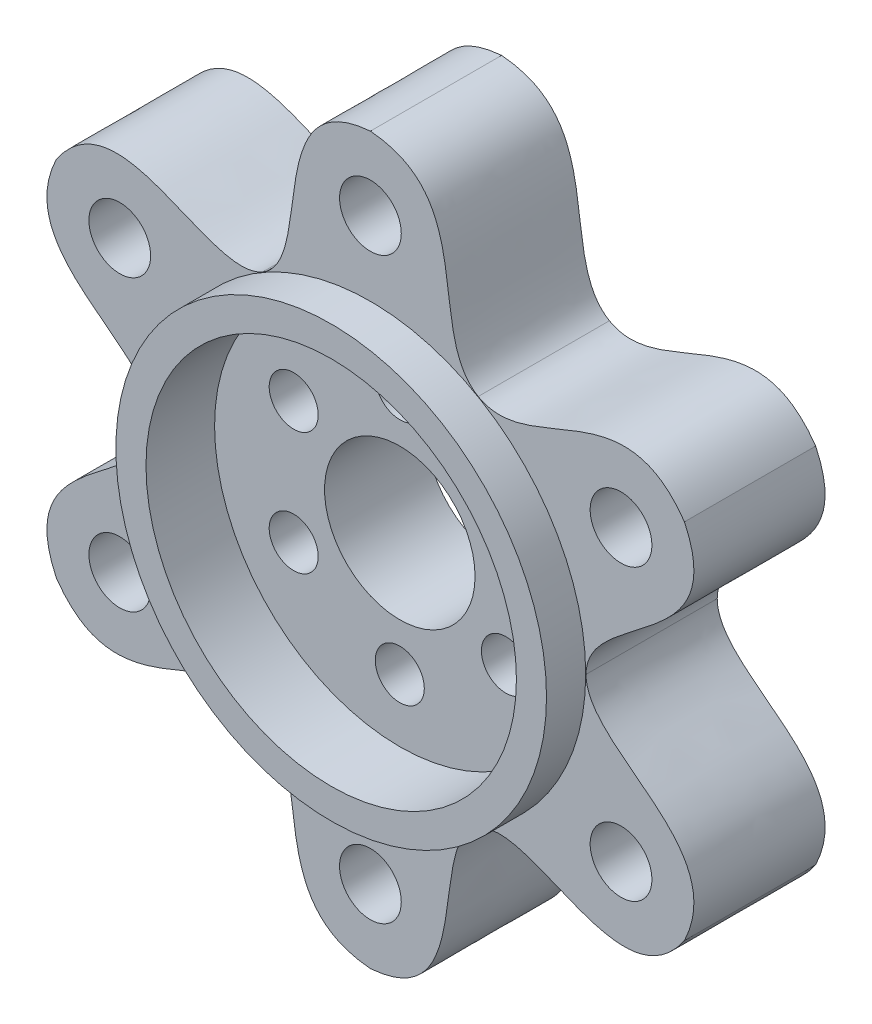
ISO-10303-21;
HEADER;
FILE_DESCRIPTION(('STEP AP214'),'2;1');
FILE_NAME('part.step','',(''),(''),'','','');
FILE_SCHEMA(('AUTOMOTIVE_DESIGN { 1 0 10303 214 1 1 1 1 }'));
ENDSEC;
DATA;
#1=APPLICATION_CONTEXT('core data for automotive mechanical design processes');
#2=APPLICATION_PROTOCOL_DEFINITION('international standard','automotive_design',2000,#1);
#3=PRODUCT_CONTEXT('',#1,'mechanical');
#4=PRODUCT('Part','Part','',(#3));
#5=PRODUCT_RELATED_PRODUCT_CATEGORY('part','',(#4));
#6=PRODUCT_DEFINITION_FORMATION('','',#4);
#7=PRODUCT_DEFINITION_CONTEXT('part definition',#1,'design');
#8=PRODUCT_DEFINITION('design','',#6,#7);
#9=PRODUCT_DEFINITION_SHAPE('','',#8);
#10=(LENGTH_UNIT() NAMED_UNIT(*) SI_UNIT(.MILLI.,.METRE.));
#11=(NAMED_UNIT(*) PLANE_ANGLE_UNIT() SI_UNIT($,.RADIAN.));
#12=(NAMED_UNIT(*) SI_UNIT($,.STERADIAN.) SOLID_ANGLE_UNIT());
#13=UNCERTAINTY_MEASURE_WITH_UNIT(LENGTH_MEASURE(1.E-05),#10,'distance_accuracy_value','');
#14=(GEOMETRIC_REPRESENTATION_CONTEXT(3) GLOBAL_UNCERTAINTY_ASSIGNED_CONTEXT((#13)) GLOBAL_UNIT_ASSIGNED_CONTEXT((#10,
#11,#12)) REPRESENTATION_CONTEXT('',''));
#15=CARTESIAN_POINT('',(0.,0.,0.));
#16=DIRECTION('',(0.,0.,1.));
#17=DIRECTION('',(1.,0.,0.));
#18=AXIS2_PLACEMENT_3D('',#15,#16,#17);
#19=CARTESIAN_POINT('',(13.748153285078,7.9375,17.));
#20=DIRECTION('',(0.,0.,-1.));
#21=DIRECTION('',(-1.,0.,0.));
#22=AXIS2_PLACEMENT_3D('',#19,#20,#21);
#23=CYLINDRICAL_SURFACE('',#22,3.175);
#24=CARTESIAN_POINT('',(13.748153285078,7.9375,0.));
#25=DIRECTION('',(0.,0.,1.));
#26=DIRECTION('',(1.,0.,0.));
#27=AXIS2_PLACEMENT_3D('',#24,#25,#26);
#28=CIRCLE('',#27,3.175);
#29=CARTESIAN_POINT('',(16.923153285078,7.9375,0.));
#30=VERTEX_POINT('',#29);
#31=EDGE_CURVE('E283',#30,#30,#28,.T.);
#32=ORIENTED_EDGE('',*,*,#31,.F.);
#33=EDGE_LOOP('',(#32));
#34=FACE_BOUND('',#33,.T.);
#35=CARTESIAN_POINT('',(13.748153285078,7.9375,13.19));
#36=DIRECTION('',(0.,0.,1.));
#37=DIRECTION('',(1.,0.,0.));
#38=AXIS2_PLACEMENT_3D('',#35,#36,#37);
#39=CIRCLE('',#38,3.175);
#40=CARTESIAN_POINT('',(16.923153285078,7.9375,13.19));
#41=VERTEX_POINT('',#40);
#42=EDGE_CURVE('E533',#41,#41,#39,.T.);
#43=ORIENTED_EDGE('',*,*,#42,.T.);
#44=EDGE_LOOP('',(#43));
#45=FACE_BOUND('',#44,.T.);
#46=ADVANCED_FACE('F273',(#34,#45),#23,.F.);
#47=CARTESIAN_POINT('',(13.748153285078,-7.9375,17.));
#48=DIRECTION('',(0.,0.,-1.));
#49=DIRECTION('',(-1.,0.,0.));
#50=AXIS2_PLACEMENT_3D('',#47,#48,#49);
#51=CYLINDRICAL_SURFACE('',#50,3.175);
#52=CARTESIAN_POINT('',(13.748153285078,-7.9375,0.));
#53=DIRECTION('',(0.,0.,1.));
#54=DIRECTION('',(1.,0.,0.));
#55=AXIS2_PLACEMENT_3D('',#52,#53,#54);
#56=CIRCLE('',#55,3.175);
#57=CARTESIAN_POINT('',(16.923153285078,-7.9375,0.));
#58=VERTEX_POINT('',#57);
#59=EDGE_CURVE('E521',#58,#58,#56,.T.);
#60=ORIENTED_EDGE('',*,*,#59,.F.);
#61=EDGE_LOOP('',(#60));
#62=FACE_BOUND('',#61,.T.);
#63=CARTESIAN_POINT('',(13.748153285078,-7.9375,13.19));
#64=DIRECTION('',(0.,0.,1.));
#65=DIRECTION('',(1.,0.,0.));
#66=AXIS2_PLACEMENT_3D('',#63,#64,#65);
#67=CIRCLE('',#66,3.175);
#68=CARTESIAN_POINT('',(16.923153285078,-7.9375,13.19));
#69=VERTEX_POINT('',#68);
#70=EDGE_CURVE('E536',#69,#69,#67,.T.);
#71=ORIENTED_EDGE('',*,*,#70,.T.);
#72=EDGE_LOOP('',(#71));
#73=FACE_BOUND('',#72,.T.);
#74=ADVANCED_FACE('F529',(#62,#73),#51,.F.);
#75=CARTESIAN_POINT('',(0.,-15.875,17.));
#76=DIRECTION('',(0.,0.,-1.));
#77=DIRECTION('',(-1.,0.,0.));
#78=AXIS2_PLACEMENT_3D('',#75,#76,#77);
#79=CYLINDRICAL_SURFACE('',#78,3.175);
#80=CARTESIAN_POINT('',(0.,-15.875,0.));
#81=DIRECTION('',(0.,0.,1.));
#82=DIRECTION('',(1.,0.,0.));
#83=AXIS2_PLACEMENT_3D('',#80,#81,#82);
#84=CIRCLE('',#83,3.175);
#85=CARTESIAN_POINT('',(3.175,-15.875,0.));
#86=VERTEX_POINT('',#85);
#87=EDGE_CURVE('E518',#86,#86,#84,.T.);
#88=ORIENTED_EDGE('',*,*,#87,.F.);
#89=EDGE_LOOP('',(#88));
#90=FACE_BOUND('',#89,.T.);
#91=CARTESIAN_POINT('',(0.,-15.875,13.19));
#92=DIRECTION('',(0.,0.,1.));
#93=DIRECTION('',(1.,0.,0.));
#94=AXIS2_PLACEMENT_3D('',#91,#92,#93);
#95=CIRCLE('',#94,3.175);
#96=CARTESIAN_POINT('',(3.175,-15.875,13.19));
#97=VERTEX_POINT('',#96);
#98=EDGE_CURVE('E542',#97,#97,#95,.T.);
#99=ORIENTED_EDGE('',*,*,#98,.T.);
#100=EDGE_LOOP('',(#99));
#101=FACE_BOUND('',#100,.T.);
#102=ADVANCED_FACE('F759',(#90,#101),#79,.F.);
#103=CARTESIAN_POINT('',(-13.748153285078,-7.93750000000001,17.));
#104=DIRECTION('',(0.,0.,-1.));
#105=DIRECTION('',(-1.,0.,0.));
#106=AXIS2_PLACEMENT_3D('',#103,#104,#105);
#107=CYLINDRICAL_SURFACE('',#106,3.175);
#108=CARTESIAN_POINT('',(-13.748153285078,-7.93750000000001,0.));
#109=DIRECTION('',(0.,0.,1.));
#110=DIRECTION('',(1.,0.,0.));
#111=AXIS2_PLACEMENT_3D('',#108,#109,#110);
#112=CIRCLE('',#111,3.175);
#113=CARTESIAN_POINT('',(-10.573153285078,-7.93750000000001,0.));
#114=VERTEX_POINT('',#113);
#115=EDGE_CURVE('E515',#114,#114,#112,.T.);
#116=ORIENTED_EDGE('',*,*,#115,.F.);
#117=EDGE_LOOP('',(#116));
#118=FACE_BOUND('',#117,.T.);
#119=CARTESIAN_POINT('',(-13.748153285078,-7.93750000000001,13.19));
#120=DIRECTION('',(0.,0.,1.));
#121=DIRECTION('',(1.,0.,0.));
#122=AXIS2_PLACEMENT_3D('',#119,#120,#121);
#123=CIRCLE('',#122,3.175);
#124=CARTESIAN_POINT('',(-10.573153285078,-7.93750000000001,13.19));
#125=VERTEX_POINT('',#124);
#126=EDGE_CURVE('E1036',#125,#125,#123,.T.);
#127=ORIENTED_EDGE('',*,*,#126,.T.);
#128=EDGE_LOOP('',(#127));
#129=FACE_BOUND('',#128,.T.);
#130=ADVANCED_FACE('F769',(#118,#129),#107,.F.);
#131=CARTESIAN_POINT('',(-13.748153285078,7.93749999999999,17.));
#132=DIRECTION('',(0.,0.,-1.));
#133=DIRECTION('',(-1.,0.,0.));
#134=AXIS2_PLACEMENT_3D('',#131,#132,#133);
#135=CYLINDRICAL_SURFACE('',#134,3.175);
#136=CARTESIAN_POINT('',(-13.748153285078,7.93749999999999,0.));
#137=DIRECTION('',(0.,0.,1.));
#138=DIRECTION('',(1.,0.,0.));
#139=AXIS2_PLACEMENT_3D('',#136,#137,#138);
#140=CIRCLE('',#139,3.175);
#141=CARTESIAN_POINT('',(-10.573153285078,7.93749999999999,0.));
#142=VERTEX_POINT('',#141);
#143=EDGE_CURVE('E512',#142,#142,#140,.T.);
#144=ORIENTED_EDGE('',*,*,#143,.F.);
#145=EDGE_LOOP('',(#144));
#146=FACE_BOUND('',#145,.T.);
#147=CARTESIAN_POINT('',(-13.748153285078,7.93749999999999,13.19));
#148=DIRECTION('',(0.,0.,1.));
#149=DIRECTION('',(1.,0.,0.));
#150=AXIS2_PLACEMENT_3D('',#147,#148,#149);
#151=CIRCLE('',#150,3.175);
#152=CARTESIAN_POINT('',(-10.573153285078,7.93749999999999,13.19));
#153=VERTEX_POINT('',#152);
#154=EDGE_CURVE('E1033',#153,#153,#151,.T.);
#155=ORIENTED_EDGE('',*,*,#154,.T.);
#156=EDGE_LOOP('',(#155));
#157=FACE_BOUND('',#156,.T.);
#158=ADVANCED_FACE('F779',(#146,#157),#135,.F.);
#159=CARTESIAN_POINT('',(0.,0.,17.));
#160=DIRECTION('',(0.,0.,-1.));
#161=DIRECTION('',(-1.,0.,0.));
#162=AXIS2_PLACEMENT_3D('',#159,#160,#161);
#163=CYLINDRICAL_SURFACE('',#162,9.75);
#164=CARTESIAN_POINT('',(0.,0.,0.));
#165=DIRECTION('',(0.,0.,1.));
#166=DIRECTION('',(1.,0.,0.));
#167=AXIS2_PLACEMENT_3D('',#164,#165,#166);
#168=CIRCLE('',#167,9.75);
#169=CARTESIAN_POINT('',(9.75,0.,0.));
#170=VERTEX_POINT('',#169);
#171=EDGE_CURVE('E509',#170,#170,#168,.T.);
#172=ORIENTED_EDGE('',*,*,#171,.F.);
#173=EDGE_LOOP('',(#172));
#174=FACE_BOUND('',#173,.T.);
#175=CARTESIAN_POINT('',(0.,0.,13.19));
#176=DIRECTION('',(0.,0.,1.));
#177=DIRECTION('',(1.,0.,0.));
#178=AXIS2_PLACEMENT_3D('',#175,#176,#177);
#179=CIRCLE('',#178,9.75);
#180=CARTESIAN_POINT('',(9.75,0.,13.19));
#181=VERTEX_POINT('',#180);
#182=EDGE_CURVE('E1029',#181,#181,#179,.T.);
#183=ORIENTED_EDGE('',*,*,#182,.T.);
#184=EDGE_LOOP('',(#183));
#185=FACE_BOUND('',#184,.T.);
#186=ADVANCED_FACE('F789',(#174,#185),#163,.F.);
#187=CARTESIAN_POINT('',(0.,15.875,17.));
#188=DIRECTION('',(0.,0.,-1.));
#189=DIRECTION('',(-1.,0.,0.));
#190=AXIS2_PLACEMENT_3D('',#187,#188,#189);
#191=CYLINDRICAL_SURFACE('',#190,3.175);
#192=CARTESIAN_POINT('',(0.,15.875,0.));
#193=DIRECTION('',(0.,0.,1.));
#194=DIRECTION('',(1.,0.,0.));
#195=AXIS2_PLACEMENT_3D('',#192,#193,#194);
#196=CIRCLE('',#195,3.175);
#197=CARTESIAN_POINT('',(3.175,15.875,0.));
#198=VERTEX_POINT('',#197);
#199=EDGE_CURVE('E504',#198,#198,#196,.T.);
#200=ORIENTED_EDGE('',*,*,#199,.F.);
#201=EDGE_LOOP('',(#200));
#202=FACE_BOUND('',#201,.T.);
#203=CARTESIAN_POINT('',(0.,15.875,13.19));
#204=DIRECTION('',(0.,0.,1.));
#205=DIRECTION('',(1.,0.,0.));
#206=AXIS2_PLACEMENT_3D('',#203,#204,#205);
#207=CIRCLE('',#206,3.175);
#208=CARTESIAN_POINT('',(3.175,15.875,13.19));
#209=VERTEX_POINT('',#208);
#210=EDGE_CURVE('E277',#209,#209,#207,.T.);
#211=ORIENTED_EDGE('',*,*,#210,.T.);
#212=EDGE_LOOP('',(#211));
#213=FACE_BOUND('',#212,.T.);
#214=ADVANCED_FACE('F799',(#202,#213),#191,.F.);
#215=CARTESIAN_POINT('',(0.,0.,17.));
#216=DIRECTION('',(0.,0.,1.));
#217=DIRECTION('',(1.,0.,0.));
#218=AXIS2_PLACEMENT_3D('',#215,#216,#217);
#219=PLANE('',#218);
#220=CARTESIAN_POINT('',(0.,0.,17.));
#221=DIRECTION('',(0.,0.,1.));
#222=DIRECTION('',(1.,0.,0.));
#223=AXIS2_PLACEMENT_3D('',#220,#221,#222);
#224=CIRCLE('',#223,27.9);
#225=CARTESIAN_POINT('',(27.9,0.,17.));
#226=VERTEX_POINT('',#225);
#227=EDGE_CURVE('E12',#226,#226,#224,.T.);
#228=ORIENTED_EDGE('',*,*,#227,.F.);
#229=EDGE_LOOP('',(#228));
#230=FACE_BOUND('',#229,.T.);
#231=CARTESIAN_POINT('',(32.4759523621902,-18.7499999145,17.));
#232=DIRECTION('',(0.,0.,1.));
#233=DIRECTION('',(1.,0.,0.));
#234=AXIS2_PLACEMENT_3D('',#231,#232,#233);
#235=CIRCLE('',#234,3.99999999999999);
#236=CARTESIAN_POINT('',(36.4759523621902,-18.7499999145,17.));
#237=VERTEX_POINT('',#236);
#238=EDGE_CURVE('E477',#237,#237,#235,.T.);
#239=ORIENTED_EDGE('',*,*,#238,.F.);
#240=EDGE_LOOP('',(#239));
#241=FACE_BOUND('',#240,.T.);
#242=CARTESIAN_POINT('',(-32.4759526583709,18.7500000855,17.));
#243=DIRECTION('',(0.,0.,1.));
#244=DIRECTION('',(1.,0.,0.));
#245=AXIS2_PLACEMENT_3D('',#242,#243,#244);
#246=CIRCLE('',#245,4.00000000000001);
#247=CARTESIAN_POINT('',(-28.4759526583709,18.7500000855,17.));
#248=VERTEX_POINT('',#247);
#249=EDGE_CURVE('E489',#248,#248,#246,.T.);
#250=ORIENTED_EDGE('',*,*,#249,.F.);
#251=EDGE_LOOP('',(#250));
#252=FACE_BOUND('',#251,.T.);
#253=CARTESIAN_POINT('',(0.,37.500000057,17.));
#254=DIRECTION('',(0.,0.,1.));
#255=DIRECTION('',(1.,0.,0.));
#256=AXIS2_PLACEMENT_3D('',#253,#254,#255);
#257=CIRCLE('',#256,3.99999999999999);
#258=CARTESIAN_POINT('',(3.99999999999999,37.500000057,17.));
#259=VERTEX_POINT('',#258);
#260=EDGE_CURVE('E501',#259,#259,#257,.T.);
#261=ORIENTED_EDGE('',*,*,#260,.F.);
#262=EDGE_LOOP('',(#261));
#263=FACE_BOUND('',#262,.T.);
#264=CARTESIAN_POINT('',(-32.4759527570978,-18.7499999145,17.));
#265=DIRECTION('',(0.,0.,1.));
#266=DIRECTION('',(1.,0.,0.));
#267=AXIS2_PLACEMENT_3D('',#264,#265,#266);
#268=CIRCLE('',#267,4.00000000000002);
#269=CARTESIAN_POINT('',(-28.4759527570978,-18.7499999145,17.));
#270=VERTEX_POINT('',#269);
#271=EDGE_CURVE('E495',#270,#270,#268,.T.);
#272=ORIENTED_EDGE('',*,*,#271,.F.);
#273=EDGE_LOOP('',(#272));
#274=FACE_BOUND('',#273,.T.);
#275=CARTESIAN_POINT('',(32.4759526583709,18.7500000855,17.));
#276=DIRECTION('',(0.,0.,1.));
#277=DIRECTION('',(1.,0.,0.));
#278=AXIS2_PLACEMENT_3D('',#275,#276,#277);
#279=CIRCLE('',#278,3.99999999999999);
#280=CARTESIAN_POINT('',(36.4759526583709,18.7500000855,17.));
#281=VERTEX_POINT('',#280);
#282=EDGE_CURVE('E483',#281,#281,#279,.T.);
#283=ORIENTED_EDGE('',*,*,#282,.F.);
#284=EDGE_LOOP('',(#283));
#285=FACE_BOUND('',#284,.T.);
#286=CARTESIAN_POINT('',(-1.97453782491142E-07,-37.500000057,17.));
#287=DIRECTION('',(0.,0.,1.));
#288=DIRECTION('',(1.,0.,0.));
#289=AXIS2_PLACEMENT_3D('',#286,#287,#288);
#290=CIRCLE('',#289,4.00000000000001);
#291=CARTESIAN_POINT('',(3.99999980254623,-37.500000057,17.));
#292=VERTEX_POINT('',#291);
#293=EDGE_CURVE('E469',#292,#292,#290,.T.);
#294=ORIENTED_EDGE('',*,*,#293,.F.);
#295=EDGE_LOOP('',(#294));
#296=FACE_BOUND('',#295,.T.);
#297=CARTESIAN_POINT('',(-40.6945337238305,23.4950000000005,17.));
#298=CARTESIAN_POINT('',(-32.6028055293907,35.2247865082349,17.));
#299=CARTESIAN_POINT('',(-20.94881750761,20.2307145845891,17.));
#300=CARTESIAN_POINT('',(-13.97,24.1967497817372,17.));
#301=B_SPLINE_CURVE_WITH_KNOTS('',3,(#297,#298,#299,#300),.UNSPECIFIED.,.F.,.F.,(4,4),(0.,1.),.UNSPECIFIED.);
#302=CARTESIAN_POINT('',(-40.6945337238305,23.4950000000005,17.));
#303=VERTEX_POINT('',#302);
#304=CARTESIAN_POINT('',(-13.97,24.1967497817372,17.));
#305=VERTEX_POINT('',#304);
#306=EDGE_CURVE('E405',#303,#305,#301,.T.);
#307=ORIENTED_EDGE('',*,*,#306,.F.);
#308=CARTESIAN_POINT('',(-40.6945337238305,23.4950000000005,17.));
#309=CARTESIAN_POINT('',(-46.8069627237099,10.6224645689798,17.));
#310=CARTESIAN_POINT('',(-27.9947215207708,8.02685084854053,17.));
#311=CARTESIAN_POINT('',(-27.94,1.94384169859256E-13,17.));
#312=B_SPLINE_CURVE_WITH_KNOTS('',3,(#308,#309,#310,#311),.UNSPECIFIED.,.F.,.F.,(4,4),(0.,1.),.UNSPECIFIED.);
#313=CARTESIAN_POINT('',(-27.94,2.03925399365807E-13,17.));
#314=VERTEX_POINT('',#313);
#315=EDGE_CURVE('E385',#303,#314,#312,.T.);
#316=ORIENTED_EDGE('',*,*,#315,.T.);
#317=CARTESIAN_POINT('',(-40.694533723831,-23.4949999999996,17.));
#318=CARTESIAN_POINT('',(-46.8069627237101,-10.6224645689788,17.));
#319=CARTESIAN_POINT('',(-27.9947215207715,-8.02685084853972,17.));
#320=CARTESIAN_POINT('',(-27.94,2.03925399365807E-13,17.));
#321=B_SPLINE_CURVE_WITH_KNOTS('',3,(#317,#318,#319,#320),.UNSPECIFIED.,.F.,.F.,(4,4),(0.,1.),.UNSPECIFIED.);
#322=CARTESIAN_POINT('',(-40.694533723831,-23.4949999999996,17.));
#323=VERTEX_POINT('',#322);
#324=EDGE_CURVE('E398',#323,#314,#321,.T.);
#325=ORIENTED_EDGE('',*,*,#324,.F.);
#326=CARTESIAN_POINT('',(-40.694533723831,-23.4949999999996,17.));
#327=CARTESIAN_POINT('',(-32.6028055293914,-35.2247865082342,17.));
#328=CARTESIAN_POINT('',(-20.9488175076101,-20.2307145845882,17.));
#329=CARTESIAN_POINT('',(-13.9700000000001,-24.1967497817372,17.));
#330=B_SPLINE_CURVE_WITH_KNOTS('',3,(#326,#327,#328,#329),.UNSPECIFIED.,.F.,.F.,(4,4),(0.,1.),.UNSPECIFIED.);
#331=CARTESIAN_POINT('',(-13.9700000000001,-24.1967497817372,17.));
#332=VERTEX_POINT('',#331);
#333=EDGE_CURVE('E638',#323,#332,#330,.T.);
#334=ORIENTED_EDGE('',*,*,#333,.T.);
#335=CARTESIAN_POINT('',(-3.24659969272524E-13,-46.99,17.));
#336=CARTESIAN_POINT('',(-14.2041571943192,-45.8472510772136,17.));
#337=CARTESIAN_POINT('',(-7.0459040131616,-28.2575654331289,17.));
#338=CARTESIAN_POINT('',(-13.9700000000001,-24.1967497817372,17.));
#339=B_SPLINE_CURVE_WITH_KNOTS('',3,(#335,#336,#337,#338),.UNSPECIFIED.,.F.,.F.,(4,4),(0.,1.),.UNSPECIFIED.);
#340=CARTESIAN_POINT('',(-3.24659969272524E-13,-46.99,17.));
#341=VERTEX_POINT('',#340);
#342=EDGE_CURVE('E646',#341,#332,#339,.T.);
#343=ORIENTED_EDGE('',*,*,#342,.F.);
#344=CARTESIAN_POINT('',(-3.24659969272524E-13,-46.99,17.));
#345=CARTESIAN_POINT('',(14.2041571943185,-45.8472510772138,17.));
#346=CARTESIAN_POINT('',(7.04590401316082,-28.2575654331289,17.));
#347=CARTESIAN_POINT('',(13.9699999999999,-24.1967497817373,17.));
#348=B_SPLINE_CURVE_WITH_KNOTS('',3,(#344,#345,#346,#347),.UNSPECIFIED.,.F.,.F.,(4,4),(0.,1.),.UNSPECIFIED.);
#349=CARTESIAN_POINT('',(13.9699999999999,-24.1967497817373,17.));
#350=VERTEX_POINT('',#349);
#351=EDGE_CURVE('E330',#341,#350,#348,.T.);
#352=ORIENTED_EDGE('',*,*,#351,.T.);
#353=CARTESIAN_POINT('',(40.6945337238307,-23.4950000000002,17.));
#354=CARTESIAN_POINT('',(32.602805529391,-35.2247865082346,17.));
#355=CARTESIAN_POINT('',(20.9488175076099,-20.2307145845891,17.));
#356=CARTESIAN_POINT('',(13.9699999999999,-24.1967497817373,17.));
#357=B_SPLINE_CURVE_WITH_KNOTS('',3,(#353,#354,#355,#356),.UNSPECIFIED.,.F.,.F.,(4,4),(0.,1.),.UNSPECIFIED.);
#358=CARTESIAN_POINT('',(40.6945337238307,-23.4950000000002,17.));
#359=VERTEX_POINT('',#358);
#360=EDGE_CURVE('E590',#359,#350,#357,.T.);
#361=ORIENTED_EDGE('',*,*,#360,.F.);
#362=CARTESIAN_POINT('',(40.6945337238307,-23.4950000000002,17.));
#363=CARTESIAN_POINT('',(46.8069627237099,-10.6224645689795,17.));
#364=CARTESIAN_POINT('',(27.9947215207708,-8.02685084854033,17.));
#365=CARTESIAN_POINT('',(27.94,0.,17.));
#366=B_SPLINE_CURVE_WITH_KNOTS('',3,(#362,#363,#364,#365),.UNSPECIFIED.,.F.,.F.,(4,4),(0.,1.),.UNSPECIFIED.);
#367=CARTESIAN_POINT('',(27.94,0.,17.));
#368=VERTEX_POINT('',#367);
#369=EDGE_CURVE('E446',#359,#368,#366,.T.);
#370=ORIENTED_EDGE('',*,*,#369,.T.);
#371=CARTESIAN_POINT('',(40.6945337238308,23.4949999999999,17.));
#372=CARTESIAN_POINT('',(46.80696272371,10.6224645689791,17.));
#373=CARTESIAN_POINT('',(27.9947215207714,8.02685084853992,17.));
#374=CARTESIAN_POINT('',(27.94,0.,17.));
#375=B_SPLINE_CURVE_WITH_KNOTS('',3,(#371,#372,#373,#374),.UNSPECIFIED.,.F.,.F.,(4,4),(0.,1.),.UNSPECIFIED.);
#376=CARTESIAN_POINT('',(40.6945337238308,23.4949999999999,17.));
#377=VERTEX_POINT('',#376);
#378=EDGE_CURVE('E454',#377,#368,#375,.T.);
#379=ORIENTED_EDGE('',*,*,#378,.F.);
#380=CARTESIAN_POINT('',(40.6945337238308,23.4949999999999,17.));
#381=CARTESIAN_POINT('',(32.6028055293912,35.2247865082344,17.));
#382=CARTESIAN_POINT('',(20.9488175076099,20.2307145845882,17.));
#383=CARTESIAN_POINT('',(13.97,24.1967497817372,17.));
#384=B_SPLINE_CURVE_WITH_KNOTS('',3,(#380,#381,#382,#383),.UNSPECIFIED.,.F.,.F.,(4,4),(0.,1.),.UNSPECIFIED.);
#385=CARTESIAN_POINT('',(13.97,24.1967497817372,17.));
#386=VERTEX_POINT('',#385);
#387=EDGE_CURVE('E308',#377,#386,#384,.T.);
#388=ORIENTED_EDGE('',*,*,#387,.T.);
#389=CARTESIAN_POINT('',(0.,46.99,17.));
#390=CARTESIAN_POINT('',(14.2041571943189,45.8472510772137,17.));
#391=CARTESIAN_POINT('',(7.04590401316146,28.2575654331289,17.));
#392=CARTESIAN_POINT('',(13.97,24.1967497817372,17.));
#393=B_SPLINE_CURVE_WITH_KNOTS('',3,(#389,#390,#391,#392),.UNSPECIFIED.,.F.,.F.,(4,4),(0.,1.),.UNSPECIFIED.);
#394=CARTESIAN_POINT('',(0.,46.99,17.));
#395=VERTEX_POINT('',#394);
#396=EDGE_CURVE('E610',#395,#386,#393,.T.);
#397=ORIENTED_EDGE('',*,*,#396,.F.);
#398=CARTESIAN_POINT('',(0.,46.99,17.));
#399=CARTESIAN_POINT('',(-14.2041571943189,45.8472510772137,17.));
#400=CARTESIAN_POINT('',(-7.04590401316116,28.2575654331289,17.));
#401=CARTESIAN_POINT('',(-13.97,24.1967497817372,17.));
#402=B_SPLINE_CURVE_WITH_KNOTS('',3,(#398,#399,#400,#401),.UNSPECIFIED.,.F.,.F.,(4,4),(0.,1.),.UNSPECIFIED.);
#403=EDGE_CURVE('E401',#395,#305,#402,.T.);
#404=ORIENTED_EDGE('',*,*,#403,.T.);
#405=EDGE_LOOP('',(#307,#316,#325,#334,#343,#352,#361,#370,#379,#388,#397,#404));
#406=FACE_BOUND('',#405,.T.);
#407=ADVANCED_FACE('F661',(#230,#241,#252,#263,#274,#285,#296,#406),#219,.T.);
#408=CARTESIAN_POINT('',(0.,0.,0.));
#409=DIRECTION('',(0.,0.,1.));
#410=DIRECTION('',(1.,0.,0.));
#411=AXIS2_PLACEMENT_3D('',#408,#409,#410);
#412=PLANE('',#411);
#413=CARTESIAN_POINT('',(0.,37.500000057,0.));
#414=DIRECTION('',(0.,0.,1.));
#415=DIRECTION('',(1.,0.,0.));
#416=AXIS2_PLACEMENT_3D('',#413,#414,#415);
#417=CIRCLE('',#416,3.99999999999999);
#418=CARTESIAN_POINT('',(3.99999999999999,37.500000057,0.));
#419=VERTEX_POINT('',#418);
#420=EDGE_CURVE('E498',#419,#419,#417,.T.);
#421=ORIENTED_EDGE('',*,*,#420,.T.);
#422=EDGE_LOOP('',(#421));
#423=FACE_BOUND('',#422,.T.);
#424=CARTESIAN_POINT('',(-32.4759527570978,-18.7499999145,0.));
#425=DIRECTION('',(0.,0.,1.));
#426=DIRECTION('',(1.,0.,0.));
#427=AXIS2_PLACEMENT_3D('',#424,#425,#426);
#428=CIRCLE('',#427,4.00000000000002);
#429=CARTESIAN_POINT('',(-28.4759527570978,-18.7499999145,0.));
#430=VERTEX_POINT('',#429);
#431=EDGE_CURVE('E492',#430,#430,#428,.T.);
#432=ORIENTED_EDGE('',*,*,#431,.T.);
#433=EDGE_LOOP('',(#432));
#434=FACE_BOUND('',#433,.T.);
#435=CARTESIAN_POINT('',(-32.4759526583709,18.7500000855,0.));
#436=DIRECTION('',(0.,0.,1.));
#437=DIRECTION('',(1.,0.,0.));
#438=AXIS2_PLACEMENT_3D('',#435,#436,#437);
#439=CIRCLE('',#438,4.00000000000001);
#440=CARTESIAN_POINT('',(-28.4759526583709,18.7500000855,0.));
#441=VERTEX_POINT('',#440);
#442=EDGE_CURVE('E486',#441,#441,#439,.T.);
#443=ORIENTED_EDGE('',*,*,#442,.T.);
#444=EDGE_LOOP('',(#443));
#445=FACE_BOUND('',#444,.T.);
#446=CARTESIAN_POINT('',(32.4759526583709,18.7500000855,0.));
#447=DIRECTION('',(0.,0.,1.));
#448=DIRECTION('',(1.,0.,0.));
#449=AXIS2_PLACEMENT_3D('',#446,#447,#448);
#450=CIRCLE('',#449,3.99999999999999);
#451=CARTESIAN_POINT('',(36.4759526583709,18.7500000855,0.));
#452=VERTEX_POINT('',#451);
#453=EDGE_CURVE('E480',#452,#452,#450,.T.);
#454=ORIENTED_EDGE('',*,*,#453,.T.);
#455=EDGE_LOOP('',(#454));
#456=FACE_BOUND('',#455,.T.);
#457=CARTESIAN_POINT('',(32.4759523621902,-18.7499999145,0.));
#458=DIRECTION('',(0.,0.,1.));
#459=DIRECTION('',(1.,0.,0.));
#460=AXIS2_PLACEMENT_3D('',#457,#458,#459);
#461=CIRCLE('',#460,3.99999999999999);
#462=CARTESIAN_POINT('',(36.4759523621902,-18.7499999145,0.));
#463=VERTEX_POINT('',#462);
#464=EDGE_CURVE('E472',#463,#463,#461,.T.);
#465=ORIENTED_EDGE('',*,*,#464,.T.);
#466=EDGE_LOOP('',(#465));
#467=FACE_BOUND('',#466,.T.);
#468=CARTESIAN_POINT('',(-1.97453782491142E-07,-37.500000057,0.));
#469=DIRECTION('',(0.,0.,1.));
#470=DIRECTION('',(1.,0.,0.));
#471=AXIS2_PLACEMENT_3D('',#468,#469,#470);
#472=CIRCLE('',#471,4.00000000000001);
#473=CARTESIAN_POINT('',(3.99999980254623,-37.500000057,0.));
#474=VERTEX_POINT('',#473);
#475=EDGE_CURVE('E473',#474,#474,#472,.T.);
#476=ORIENTED_EDGE('',*,*,#475,.T.);
#477=EDGE_LOOP('',(#476));
#478=FACE_BOUND('',#477,.T.);
#479=CARTESIAN_POINT('',(-40.6945337238305,23.4950000000005,0.));
#480=CARTESIAN_POINT('',(-46.8069627237099,10.6224645689798,0.));
#481=CARTESIAN_POINT('',(-27.9947215207708,8.02685084854053,0.));
#482=CARTESIAN_POINT('',(-27.94,1.94384169859256E-13,0.));
#483=B_SPLINE_CURVE_WITH_KNOTS('',3,(#479,#480,#481,#482),.UNSPECIFIED.,.F.,.F.,(4,4),(0.,1.),.UNSPECIFIED.);
#484=CARTESIAN_POINT('',(-40.6945337238305,23.4950000000005,0.));
#485=VERTEX_POINT('',#484);
#486=CARTESIAN_POINT('',(-27.94,2.03925399365807E-13,0.));
#487=VERTEX_POINT('',#486);
#488=EDGE_CURVE('E382',#485,#487,#483,.T.);
#489=ORIENTED_EDGE('',*,*,#488,.F.);
#490=CARTESIAN_POINT('',(-40.6945337238305,23.4950000000005,0.));
#491=CARTESIAN_POINT('',(-32.6028055293907,35.2247865082349,0.));
#492=CARTESIAN_POINT('',(-20.94881750761,20.2307145845891,0.));
#493=CARTESIAN_POINT('',(-13.97,24.1967497817372,0.));
#494=B_SPLINE_CURVE_WITH_KNOTS('',3,(#490,#491,#492,#493),.UNSPECIFIED.,.F.,.F.,(4,4),(0.,1.),.UNSPECIFIED.);
#495=CARTESIAN_POINT('',(-13.97,24.1967497817372,0.));
#496=VERTEX_POINT('',#495);
#497=EDGE_CURVE('E396',#485,#496,#494,.T.);
#498=ORIENTED_EDGE('',*,*,#497,.T.);
#499=CARTESIAN_POINT('',(0.,46.99,0.));
#500=CARTESIAN_POINT('',(-14.2041571943189,45.8472510772137,0.));
#501=CARTESIAN_POINT('',(-7.04590401316116,28.2575654331289,0.));
#502=CARTESIAN_POINT('',(-13.97,24.1967497817372,0.));
#503=B_SPLINE_CURVE_WITH_KNOTS('',3,(#499,#500,#501,#502),.UNSPECIFIED.,.F.,.F.,(4,4),(0.,1.),.UNSPECIFIED.);
#504=CARTESIAN_POINT('',(0.,46.99,0.));
#505=VERTEX_POINT('',#504);
#506=EDGE_CURVE('E292',#505,#496,#503,.T.);
#507=ORIENTED_EDGE('',*,*,#506,.F.);
#508=CARTESIAN_POINT('',(0.,46.99,0.));
#509=CARTESIAN_POINT('',(14.2041571943189,45.8472510772137,0.));
#510=CARTESIAN_POINT('',(7.04590401316146,28.2575654331289,0.));
#511=CARTESIAN_POINT('',(13.97,24.1967497817372,0.));
#512=B_SPLINE_CURVE_WITH_KNOTS('',3,(#508,#509,#510,#511),.UNSPECIFIED.,.F.,.F.,(4,4),(0.,1.),.UNSPECIFIED.);
#513=CARTESIAN_POINT('',(13.97,24.1967497817372,0.));
#514=VERTEX_POINT('',#513);
#515=EDGE_CURVE('E609',#505,#514,#512,.T.);
#516=ORIENTED_EDGE('',*,*,#515,.T.);
#517=CARTESIAN_POINT('',(40.6945337238308,23.4949999999999,0.));
#518=CARTESIAN_POINT('',(32.6028055293912,35.2247865082344,0.));
#519=CARTESIAN_POINT('',(20.9488175076099,20.2307145845882,0.));
#520=CARTESIAN_POINT('',(13.97,24.1967497817372,0.));
#521=B_SPLINE_CURVE_WITH_KNOTS('',3,(#517,#518,#519,#520),.UNSPECIFIED.,.F.,.F.,(4,4),(0.,1.),.UNSPECIFIED.);
#522=CARTESIAN_POINT('',(40.6945337238308,23.4949999999999,0.));
#523=VERTEX_POINT('',#522);
#524=EDGE_CURVE('E336',#523,#514,#521,.T.);
#525=ORIENTED_EDGE('',*,*,#524,.F.);
#526=CARTESIAN_POINT('',(40.6945337238308,23.4949999999999,0.));
#527=CARTESIAN_POINT('',(46.80696272371,10.6224645689791,0.));
#528=CARTESIAN_POINT('',(27.9947215207714,8.02685084853992,0.));
#529=CARTESIAN_POINT('',(27.94,0.,0.));
#530=B_SPLINE_CURVE_WITH_KNOTS('',3,(#526,#527,#528,#529),.UNSPECIFIED.,.F.,.F.,(4,4),(0.,1.),.UNSPECIFIED.);
#531=CARTESIAN_POINT('',(27.94,0.,0.));
#532=VERTEX_POINT('',#531);
#533=EDGE_CURVE('E435',#523,#532,#530,.T.);
#534=ORIENTED_EDGE('',*,*,#533,.T.);
#535=CARTESIAN_POINT('',(40.6945337238307,-23.4950000000002,0.));
#536=CARTESIAN_POINT('',(46.8069627237099,-10.6224645689795,0.));
#537=CARTESIAN_POINT('',(27.9947215207708,-8.02685084854033,0.));
#538=CARTESIAN_POINT('',(27.94,0.,0.));
#539=B_SPLINE_CURVE_WITH_KNOTS('',3,(#535,#536,#537,#538),.UNSPECIFIED.,.F.,.F.,(4,4),(0.,1.),.UNSPECIFIED.);
#540=CARTESIAN_POINT('',(40.6945337238307,-23.4950000000002,0.));
#541=VERTEX_POINT('',#540);
#542=EDGE_CURVE('E442',#541,#532,#539,.T.);
#543=ORIENTED_EDGE('',*,*,#542,.F.);
#544=CARTESIAN_POINT('',(40.6945337238307,-23.4950000000002,0.));
#545=CARTESIAN_POINT('',(32.602805529391,-35.2247865082346,0.));
#546=CARTESIAN_POINT('',(20.9488175076099,-20.2307145845891,0.));
#547=CARTESIAN_POINT('',(13.9699999999999,-24.1967497817373,0.));
#548=B_SPLINE_CURVE_WITH_KNOTS('',3,(#544,#545,#546,#547),.UNSPECIFIED.,.F.,.F.,(4,4),(0.,1.),.UNSPECIFIED.);
#549=CARTESIAN_POINT('',(13.9699999999999,-24.1967497817373,0.));
#550=VERTEX_POINT('',#549);
#551=EDGE_CURVE('E572',#541,#550,#548,.T.);
#552=ORIENTED_EDGE('',*,*,#551,.T.);
#553=CARTESIAN_POINT('',(-3.24659969272524E-13,-46.99,0.));
#554=CARTESIAN_POINT('',(14.2041571943185,-45.8472510772138,0.));
#555=CARTESIAN_POINT('',(7.04590401316082,-28.2575654331289,0.));
#556=CARTESIAN_POINT('',(13.9699999999999,-24.1967497817373,0.));
#557=B_SPLINE_CURVE_WITH_KNOTS('',3,(#553,#554,#555,#556),.UNSPECIFIED.,.F.,.F.,(4,4),(0.,1.),.UNSPECIFIED.);
#558=CARTESIAN_POINT('',(-3.24659969272524E-13,-46.99,0.));
#559=VERTEX_POINT('',#558);
#560=EDGE_CURVE('E579',#559,#550,#557,.T.);
#561=ORIENTED_EDGE('',*,*,#560,.F.);
#562=CARTESIAN_POINT('',(-3.24659969272524E-13,-46.99,0.));
#563=CARTESIAN_POINT('',(-14.2041571943192,-45.8472510772136,0.));
#564=CARTESIAN_POINT('',(-7.0459040131616,-28.2575654331289,0.));
#565=CARTESIAN_POINT('',(-13.9700000000001,-24.1967497817372,0.));
#566=B_SPLINE_CURVE_WITH_KNOTS('',3,(#562,#563,#564,#565),.UNSPECIFIED.,.F.,.F.,(4,4),(0.,1.),.UNSPECIFIED.);
#567=CARTESIAN_POINT('',(-13.9700000000001,-24.1967497817372,0.));
#568=VERTEX_POINT('',#567);
#569=EDGE_CURVE('E628',#559,#568,#566,.T.);
#570=ORIENTED_EDGE('',*,*,#569,.T.);
#571=CARTESIAN_POINT('',(-40.694533723831,-23.4949999999996,0.));
#572=CARTESIAN_POINT('',(-32.6028055293914,-35.2247865082342,0.));
#573=CARTESIAN_POINT('',(-20.9488175076101,-20.2307145845882,0.));
#574=CARTESIAN_POINT('',(-13.9700000000001,-24.1967497817372,0.));
#575=B_SPLINE_CURVE_WITH_KNOTS('',3,(#571,#572,#573,#574),.UNSPECIFIED.,.F.,.F.,(4,4),(0.,1.),.UNSPECIFIED.);
#576=CARTESIAN_POINT('',(-40.694533723831,-23.4949999999996,0.));
#577=VERTEX_POINT('',#576);
#578=EDGE_CURVE('E318',#577,#568,#575,.T.);
#579=ORIENTED_EDGE('',*,*,#578,.F.);
#580=CARTESIAN_POINT('',(-40.694533723831,-23.4949999999996,0.));
#581=CARTESIAN_POINT('',(-46.8069627237101,-10.6224645689788,0.));
#582=CARTESIAN_POINT('',(-27.9947215207715,-8.02685084853972,0.));
#583=CARTESIAN_POINT('',(-27.94,2.03925399365807E-13,0.));
#584=B_SPLINE_CURVE_WITH_KNOTS('',3,(#580,#581,#582,#583),.UNSPECIFIED.,.F.,.F.,(4,4),(0.,1.),.UNSPECIFIED.);
#585=EDGE_CURVE('E397',#577,#487,#584,.T.);
#586=ORIENTED_EDGE('',*,*,#585,.T.);
#587=EDGE_LOOP('',(#489,#498,#507,#516,#525,#534,#543,#552,#561,#570,#579,#586));
#588=FACE_BOUND('',#587,.T.);
#589=ORIENTED_EDGE('',*,*,#199,.T.);
#590=EDGE_LOOP('',(#589));
#591=FACE_BOUND('',#590,.T.);
#592=ORIENTED_EDGE('',*,*,#171,.T.);
#593=EDGE_LOOP('',(#592));
#594=FACE_BOUND('',#593,.T.);
#595=ORIENTED_EDGE('',*,*,#143,.T.);
#596=EDGE_LOOP('',(#595));
#597=FACE_BOUND('',#596,.T.);
#598=ORIENTED_EDGE('',*,*,#115,.T.);
#599=EDGE_LOOP('',(#598));
#600=FACE_BOUND('',#599,.T.);
#601=ORIENTED_EDGE('',*,*,#87,.T.);
#602=EDGE_LOOP('',(#601));
#603=FACE_BOUND('',#602,.T.);
#604=ORIENTED_EDGE('',*,*,#59,.T.);
#605=EDGE_LOOP('',(#604));
#606=FACE_BOUND('',#605,.T.);
#607=ORIENTED_EDGE('',*,*,#31,.T.);
#608=EDGE_LOOP('',(#607));
#609=FACE_BOUND('',#608,.T.);
#610=ADVANCED_FACE('F275',(#423,#434,#445,#456,#467,#478,#588,#591,#594,#597,#600,#603,#606,
#609),#412,.F.);
#611=CARTESIAN_POINT('',(0.,37.500000057,17.));
#612=DIRECTION('',(0.,0.,-1.));
#613=DIRECTION('',(-1.,0.,0.));
#614=AXIS2_PLACEMENT_3D('',#611,#612,#613);
#615=CYLINDRICAL_SURFACE('',#614,3.99999999999999);
#616=ORIENTED_EDGE('',*,*,#260,.T.);
#617=EDGE_LOOP('',(#616));
#618=FACE_BOUND('',#617,.T.);
#619=ORIENTED_EDGE('',*,*,#420,.F.);
#620=EDGE_LOOP('',(#619));
#621=FACE_BOUND('',#620,.T.);
#622=ADVANCED_FACE('F890',(#618,#621),#615,.F.);
#623=CARTESIAN_POINT('',(-32.4759527570978,-18.7499999145,17.));
#624=DIRECTION('',(0.,0.,-1.));
#625=DIRECTION('',(-1.,0.,0.));
#626=AXIS2_PLACEMENT_3D('',#623,#624,#625);
#627=CYLINDRICAL_SURFACE('',#626,4.00000000000002);
#628=ORIENTED_EDGE('',*,*,#271,.T.);
#629=EDGE_LOOP('',(#628));
#630=FACE_BOUND('',#629,.T.);
#631=ORIENTED_EDGE('',*,*,#431,.F.);
#632=EDGE_LOOP('',(#631));
#633=FACE_BOUND('',#632,.T.);
#634=ADVANCED_FACE('F927',(#630,#633),#627,.F.);
#635=CARTESIAN_POINT('',(-32.4759526583709,18.7500000855,17.));
#636=DIRECTION('',(0.,0.,-1.));
#637=DIRECTION('',(-1.,0.,0.));
#638=AXIS2_PLACEMENT_3D('',#635,#636,#637);
#639=CYLINDRICAL_SURFACE('',#638,4.00000000000001);
#640=ORIENTED_EDGE('',*,*,#249,.T.);
#641=EDGE_LOOP('',(#640));
#642=FACE_BOUND('',#641,.T.);
#643=ORIENTED_EDGE('',*,*,#442,.F.);
#644=EDGE_LOOP('',(#643));
#645=FACE_BOUND('',#644,.T.);
#646=ADVANCED_FACE('F917',(#642,#645),#639,.F.);
#647=CARTESIAN_POINT('',(32.4759526583709,18.7500000855,17.));
#648=DIRECTION('',(0.,0.,-1.));
#649=DIRECTION('',(-1.,0.,0.));
#650=AXIS2_PLACEMENT_3D('',#647,#648,#649);
#651=CYLINDRICAL_SURFACE('',#650,3.99999999999999);
#652=ORIENTED_EDGE('',*,*,#282,.T.);
#653=EDGE_LOOP('',(#652));
#654=FACE_BOUND('',#653,.T.);
#655=ORIENTED_EDGE('',*,*,#453,.F.);
#656=EDGE_LOOP('',(#655));
#657=FACE_BOUND('',#656,.T.);
#658=ADVANCED_FACE('F907',(#654,#657),#651,.F.);
#659=CARTESIAN_POINT('',(32.4759523621902,-18.7499999145,17.));
#660=DIRECTION('',(0.,0.,-1.));
#661=DIRECTION('',(-1.,0.,0.));
#662=AXIS2_PLACEMENT_3D('',#659,#660,#661);
#663=CYLINDRICAL_SURFACE('',#662,3.99999999999999);
#664=ORIENTED_EDGE('',*,*,#238,.T.);
#665=EDGE_LOOP('',(#664));
#666=FACE_BOUND('',#665,.T.);
#667=ORIENTED_EDGE('',*,*,#464,.F.);
#668=EDGE_LOOP('',(#667));
#669=FACE_BOUND('',#668,.T.);
#670=ADVANCED_FACE('F898',(#666,#669),#663,.F.);
#671=CARTESIAN_POINT('',(-1.97453782491142E-07,-37.500000057,17.));
#672=DIRECTION('',(0.,0.,-1.));
#673=DIRECTION('',(-1.,0.,0.));
#674=AXIS2_PLACEMENT_3D('',#671,#672,#673);
#675=CYLINDRICAL_SURFACE('',#674,4.00000000000001);
#676=ORIENTED_EDGE('',*,*,#293,.T.);
#677=EDGE_LOOP('',(#676));
#678=FACE_BOUND('',#677,.T.);
#679=ORIENTED_EDGE('',*,*,#475,.F.);
#680=EDGE_LOOP('',(#679));
#681=FACE_BOUND('',#680,.T.);
#682=ADVANCED_FACE('F875',(#678,#681),#675,.F.);
#683=DIRECTION('',(0.,0.,1.));
#684=VECTOR('',#683,1.);
#685=SURFACE_OF_LINEAR_EXTRUSION('',#503,#684);
#686=ORIENTED_EDGE('',*,*,#403,.F.);
#687=DIRECTION('',(0.,0.,1.));
#688=VECTOR('',#687,1.);
#689=CARTESIAN_POINT('',(0.,46.99,0.));
#690=LINE('',#689,#688);
#691=EDGE_CURVE('E476',#505,#395,#690,.T.);
#692=ORIENTED_EDGE('',*,*,#691,.F.);
#693=ORIENTED_EDGE('',*,*,#506,.T.);
#694=DIRECTION('',(0.,0.,1.));
#695=VECTOR('',#694,1.);
#696=CARTESIAN_POINT('',(-13.97,24.1967497817372,0.));
#697=LINE('',#696,#695);
#698=EDGE_CURVE('E390',#496,#305,#697,.T.);
#699=ORIENTED_EDGE('',*,*,#698,.T.);
#700=EDGE_LOOP('',(#686,#692,#693,#699));
#701=FACE_BOUND('',#700,.T.);
#702=ADVANCED_FACE('F425',(#701),#685,.T.);
#703=DIRECTION('',(0.,0.,1.));
#704=VECTOR('',#703,1.);
#705=SURFACE_OF_LINEAR_EXTRUSION('',#494,#704);
#706=ORIENTED_EDGE('',*,*,#306,.T.);
#707=ORIENTED_EDGE('',*,*,#698,.F.);
#708=ORIENTED_EDGE('',*,*,#497,.F.);
#709=DIRECTION('',(0.,0.,1.));
#710=VECTOR('',#709,1.);
#711=CARTESIAN_POINT('',(-40.6945337238305,23.4950000000005,0.));
#712=LINE('',#711,#710);
#713=EDGE_CURVE('E379',#485,#303,#712,.T.);
#714=ORIENTED_EDGE('',*,*,#713,.T.);
#715=EDGE_LOOP('',(#706,#707,#708,#714));
#716=FACE_BOUND('',#715,.T.);
#717=ADVANCED_FACE('F400',(#716),#705,.F.);
#718=DIRECTION('',(0.,0.,1.));
#719=VECTOR('',#718,1.);
#720=SURFACE_OF_LINEAR_EXTRUSION('',#539,#719);
#721=ORIENTED_EDGE('',*,*,#369,.F.);
#722=DIRECTION('',(0.,0.,1.));
#723=VECTOR('',#722,1.);
#724=CARTESIAN_POINT('',(40.6945337238307,-23.4950000000002,0.));
#725=LINE('',#724,#723);
#726=EDGE_CURVE('E441',#541,#359,#725,.T.);
#727=ORIENTED_EDGE('',*,*,#726,.F.);
#728=ORIENTED_EDGE('',*,*,#542,.T.);
#729=DIRECTION('',(0.,0.,1.));
#730=VECTOR('',#729,1.);
#731=CARTESIAN_POINT('',(27.94,0.,0.));
#732=LINE('',#731,#730);
#733=EDGE_CURVE('E463',#532,#368,#732,.T.);
#734=ORIENTED_EDGE('',*,*,#733,.T.);
#735=EDGE_LOOP('',(#721,#727,#728,#734));
#736=FACE_BOUND('',#735,.T.);
#737=ADVANCED_FACE('F424',(#736),#720,.T.);
#738=DIRECTION('',(0.,0.,1.));
#739=VECTOR('',#738,1.);
#740=SURFACE_OF_LINEAR_EXTRUSION('',#530,#739);
#741=ORIENTED_EDGE('',*,*,#378,.T.);
#742=ORIENTED_EDGE('',*,*,#733,.F.);
#743=ORIENTED_EDGE('',*,*,#533,.F.);
#744=DIRECTION('',(0.,0.,1.));
#745=VECTOR('',#744,1.);
#746=CARTESIAN_POINT('',(40.6945337238308,23.4949999999999,0.));
#747=LINE('',#746,#745);
#748=EDGE_CURVE('E349',#523,#377,#747,.T.);
#749=ORIENTED_EDGE('',*,*,#748,.T.);
#750=EDGE_LOOP('',(#741,#742,#743,#749));
#751=FACE_BOUND('',#750,.T.);
#752=ADVANCED_FACE('F427',(#751),#740,.F.);
#753=DIRECTION('',(0.,0.,1.));
#754=VECTOR('',#753,1.);
#755=SURFACE_OF_LINEAR_EXTRUSION('',#575,#754);
#756=ORIENTED_EDGE('',*,*,#333,.F.);
#757=DIRECTION('',(0.,0.,1.));
#758=VECTOR('',#757,1.);
#759=CARTESIAN_POINT('',(-40.694533723831,-23.4949999999996,0.));
#760=LINE('',#759,#758);
#761=EDGE_CURVE('E411',#577,#323,#760,.T.);
#762=ORIENTED_EDGE('',*,*,#761,.F.);
#763=ORIENTED_EDGE('',*,*,#578,.T.);
#764=DIRECTION('',(0.,0.,1.));
#765=VECTOR('',#764,1.);
#766=CARTESIAN_POINT('',(-13.9700000000001,-24.1967497817372,0.));
#767=LINE('',#766,#765);
#768=EDGE_CURVE('E455',#568,#332,#767,.T.);
#769=ORIENTED_EDGE('',*,*,#768,.T.);
#770=EDGE_LOOP('',(#756,#762,#763,#769));
#771=FACE_BOUND('',#770,.T.);
#772=ADVANCED_FACE('F431',(#771),#755,.T.);
#773=DIRECTION('',(0.,0.,1.));
#774=VECTOR('',#773,1.);
#775=SURFACE_OF_LINEAR_EXTRUSION('',#566,#774);
#776=ORIENTED_EDGE('',*,*,#342,.T.);
#777=ORIENTED_EDGE('',*,*,#768,.F.);
#778=ORIENTED_EDGE('',*,*,#569,.F.);
#779=DIRECTION('',(0.,0.,1.));
#780=VECTOR('',#779,1.);
#781=CARTESIAN_POINT('',(-3.24659969272524E-13,-46.99,0.));
#782=LINE('',#781,#780);
#783=EDGE_CURVE('E578',#559,#341,#782,.T.);
#784=ORIENTED_EDGE('',*,*,#783,.T.);
#785=EDGE_LOOP('',(#776,#777,#778,#784));
#786=FACE_BOUND('',#785,.T.);
#787=ADVANCED_FACE('F623',(#786),#775,.F.);
#788=DIRECTION('',(0.,0.,1.));
#789=VECTOR('',#788,1.);
#790=SURFACE_OF_LINEAR_EXTRUSION('',#521,#789);
#791=ORIENTED_EDGE('',*,*,#387,.F.);
#792=ORIENTED_EDGE('',*,*,#748,.F.);
#793=ORIENTED_EDGE('',*,*,#524,.T.);
#794=DIRECTION('',(0.,0.,1.));
#795=VECTOR('',#794,1.);
#796=CARTESIAN_POINT('',(13.97,24.1967497817372,0.));
#797=LINE('',#796,#795);
#798=EDGE_CURVE('E347',#514,#386,#797,.T.);
#799=ORIENTED_EDGE('',*,*,#798,.T.);
#800=EDGE_LOOP('',(#791,#792,#793,#799));
#801=FACE_BOUND('',#800,.T.);
#802=ADVANCED_FACE('F619',(#801),#790,.T.);
#803=DIRECTION('',(0.,0.,1.));
#804=VECTOR('',#803,1.);
#805=SURFACE_OF_LINEAR_EXTRUSION('',#512,#804);
#806=ORIENTED_EDGE('',*,*,#396,.T.);
#807=ORIENTED_EDGE('',*,*,#798,.F.);
#808=ORIENTED_EDGE('',*,*,#515,.F.);
#809=ORIENTED_EDGE('',*,*,#691,.T.);
#810=EDGE_LOOP('',(#806,#807,#808,#809));
#811=FACE_BOUND('',#810,.T.);
#812=ADVANCED_FACE('F622',(#811),#805,.F.);
#813=DIRECTION('',(0.,0.,1.));
#814=VECTOR('',#813,1.);
#815=SURFACE_OF_LINEAR_EXTRUSION('',#557,#814);
#816=ORIENTED_EDGE('',*,*,#351,.F.);
#817=ORIENTED_EDGE('',*,*,#783,.F.);
#818=ORIENTED_EDGE('',*,*,#560,.T.);
#819=DIRECTION('',(0.,0.,1.));
#820=VECTOR('',#819,1.);
#821=CARTESIAN_POINT('',(13.9699999999999,-24.1967497817373,0.));
#822=LINE('',#821,#820);
#823=EDGE_CURVE('E599',#550,#350,#822,.T.);
#824=ORIENTED_EDGE('',*,*,#823,.T.);
#825=EDGE_LOOP('',(#816,#817,#818,#824));
#826=FACE_BOUND('',#825,.T.);
#827=ADVANCED_FACE('F568',(#826),#815,.T.);
#828=DIRECTION('',(0.,0.,1.));
#829=VECTOR('',#828,1.);
#830=SURFACE_OF_LINEAR_EXTRUSION('',#548,#829);
#831=ORIENTED_EDGE('',*,*,#360,.T.);
#832=ORIENTED_EDGE('',*,*,#823,.F.);
#833=ORIENTED_EDGE('',*,*,#551,.F.);
#834=ORIENTED_EDGE('',*,*,#726,.T.);
#835=EDGE_LOOP('',(#831,#832,#833,#834));
#836=FACE_BOUND('',#835,.T.);
#837=ADVANCED_FACE('F563',(#836),#830,.F.);
#838=DIRECTION('',(0.,0.,1.));
#839=VECTOR('',#838,1.);
#840=SURFACE_OF_LINEAR_EXTRUSION('',#483,#839);
#841=ORIENTED_EDGE('',*,*,#315,.F.);
#842=ORIENTED_EDGE('',*,*,#713,.F.);
#843=ORIENTED_EDGE('',*,*,#488,.T.);
#844=DIRECTION('',(0.,0.,1.));
#845=VECTOR('',#844,1.);
#846=CARTESIAN_POINT('',(-27.94,2.03925399365807E-13,0.));
#847=LINE('',#846,#845);
#848=EDGE_CURVE('E591',#487,#314,#847,.T.);
#849=ORIENTED_EDGE('',*,*,#848,.T.);
#850=EDGE_LOOP('',(#841,#842,#843,#849));
#851=FACE_BOUND('',#850,.T.);
#852=ADVANCED_FACE('F381',(#851),#840,.T.);
#853=DIRECTION('',(0.,0.,1.));
#854=VECTOR('',#853,1.);
#855=SURFACE_OF_LINEAR_EXTRUSION('',#584,#854);
#856=ORIENTED_EDGE('',*,*,#324,.T.);
#857=ORIENTED_EDGE('',*,*,#848,.F.);
#858=ORIENTED_EDGE('',*,*,#585,.F.);
#859=ORIENTED_EDGE('',*,*,#761,.T.);
#860=EDGE_LOOP('',(#856,#857,#858,#859));
#861=FACE_BOUND('',#860,.T.);
#862=ADVANCED_FACE('F562',(#861),#855,.F.);
#863=CARTESIAN_POINT('',(0.,0.,-0.00199999999999853));
#864=DIRECTION('',(0.,0.,1.));
#865=DIRECTION('',(1.,0.,0.));
#866=AXIS2_PLACEMENT_3D('',#863,#864,#865);
#867=CYLINDRICAL_SURFACE('',#866,27.9);
#868=ORIENTED_EDGE('',*,*,#227,.T.);
#869=EDGE_LOOP('',(#868));
#870=FACE_BOUND('',#869,.T.);
#871=CARTESIAN_POINT('',(0.,0.,22.08));
#872=DIRECTION('',(0.,0.,1.));
#873=DIRECTION('',(1.,0.,0.));
#874=AXIS2_PLACEMENT_3D('',#871,#872,#873);
#875=CIRCLE('',#874,27.9);
#876=CARTESIAN_POINT('',(27.9,0.,22.08));
#877=VERTEX_POINT('',#876);
#878=EDGE_CURVE('E539',#877,#877,#875,.T.);
#879=ORIENTED_EDGE('',*,*,#878,.F.);
#880=EDGE_LOOP('',(#879));
#881=FACE_BOUND('',#880,.T.);
#882=ADVANCED_FACE('F703',(#870,#881),#867,.T.);
#883=CARTESIAN_POINT('',(0.,0.,-0.00199999999999853));
#884=DIRECTION('',(0.,0.,1.));
#885=DIRECTION('',(1.,0.,0.));
#886=AXIS2_PLACEMENT_3D('',#883,#884,#885);
#887=CYLINDRICAL_SURFACE('',#886,24.);
#888=CARTESIAN_POINT('',(0.,0.,22.08));
#889=DIRECTION('',(0.,0.,1.));
#890=DIRECTION('',(1.,0.,0.));
#891=AXIS2_PLACEMENT_3D('',#888,#889,#890);
#892=CIRCLE('',#891,24.);
#893=CARTESIAN_POINT('',(24.,0.,22.08));
#894=VERTEX_POINT('',#893);
#895=EDGE_CURVE('E535',#894,#894,#892,.T.);
#896=ORIENTED_EDGE('',*,*,#895,.T.);
#897=EDGE_LOOP('',(#896));
#898=FACE_BOUND('',#897,.T.);
#899=CARTESIAN_POINT('',(0.,0.,13.19));
#900=DIRECTION('',(0.,0.,1.));
#901=DIRECTION('',(1.,0.,0.));
#902=AXIS2_PLACEMENT_3D('',#899,#900,#901);
#903=CIRCLE('',#902,24.);
#904=CARTESIAN_POINT('',(24.,0.,13.19));
#905=VERTEX_POINT('',#904);
#906=EDGE_CURVE('E1025',#905,#905,#903,.T.);
#907=ORIENTED_EDGE('',*,*,#906,.F.);
#908=EDGE_LOOP('',(#907));
#909=FACE_BOUND('',#908,.T.);
#910=ADVANCED_FACE('F710',(#898,#909),#887,.F.);
#911=CARTESIAN_POINT('',(0.,0.,22.08));
#912=DIRECTION('',(0.,0.,1.));
#913=DIRECTION('',(1.,0.,0.));
#914=AXIS2_PLACEMENT_3D('',#911,#912,#913);
#915=PLANE('',#914);
#916=ORIENTED_EDGE('',*,*,#878,.T.);
#917=EDGE_LOOP('',(#916));
#918=FACE_BOUND('',#917,.T.);
#919=ORIENTED_EDGE('',*,*,#895,.F.);
#920=EDGE_LOOP('',(#919));
#921=FACE_BOUND('',#920,.T.);
#922=ADVANCED_FACE('F719',(#918,#921),#915,.T.);
#923=CARTESIAN_POINT('',(0.,0.,13.19));
#924=DIRECTION('',(0.,0.,1.));
#925=DIRECTION('',(1.,0.,0.));
#926=AXIS2_PLACEMENT_3D('',#923,#924,#925);
#927=PLANE('',#926);
#928=ORIENTED_EDGE('',*,*,#42,.F.);
#929=EDGE_LOOP('',(#928));
#930=FACE_BOUND('',#929,.T.);
#931=ORIENTED_EDGE('',*,*,#70,.F.);
#932=EDGE_LOOP('',(#931));
#933=FACE_BOUND('',#932,.T.);
#934=ORIENTED_EDGE('',*,*,#98,.F.);
#935=EDGE_LOOP('',(#934));
#936=FACE_BOUND('',#935,.T.);
#937=ORIENTED_EDGE('',*,*,#126,.F.);
#938=EDGE_LOOP('',(#937));
#939=FACE_BOUND('',#938,.T.);
#940=ORIENTED_EDGE('',*,*,#154,.F.);
#941=EDGE_LOOP('',(#940));
#942=FACE_BOUND('',#941,.T.);
#943=ORIENTED_EDGE('',*,*,#182,.F.);
#944=EDGE_LOOP('',(#943));
#945=FACE_BOUND('',#944,.T.);
#946=ORIENTED_EDGE('',*,*,#210,.F.);
#947=EDGE_LOOP('',(#946));
#948=FACE_BOUND('',#947,.T.);
#949=ORIENTED_EDGE('',*,*,#906,.T.);
#950=EDGE_LOOP('',(#949));
#951=FACE_BOUND('',#950,.T.);
#952=ADVANCED_FACE('F728',(#930,#933,#936,#939,#942,#945,#948,#951),#927,.T.);
#953=CLOSED_SHELL('',(#46,#74,#102,#130,#158,#186,#214,#407,#610,#622,#634,#646,#658,#670,#682,
#702,#717,#737,#752,#772,#787,#802,#812,#827,#837,#852,#862,#882,#910,#922,#952));
#954=MANIFOLD_SOLID_BREP('B2',#953);
#955=ADVANCED_BREP_SHAPE_REPRESENTATION('',(#18,#954),#14);
#956=SHAPE_DEFINITION_REPRESENTATION(#9,#955);
ENDSEC;
END-ISO-10303-21;
